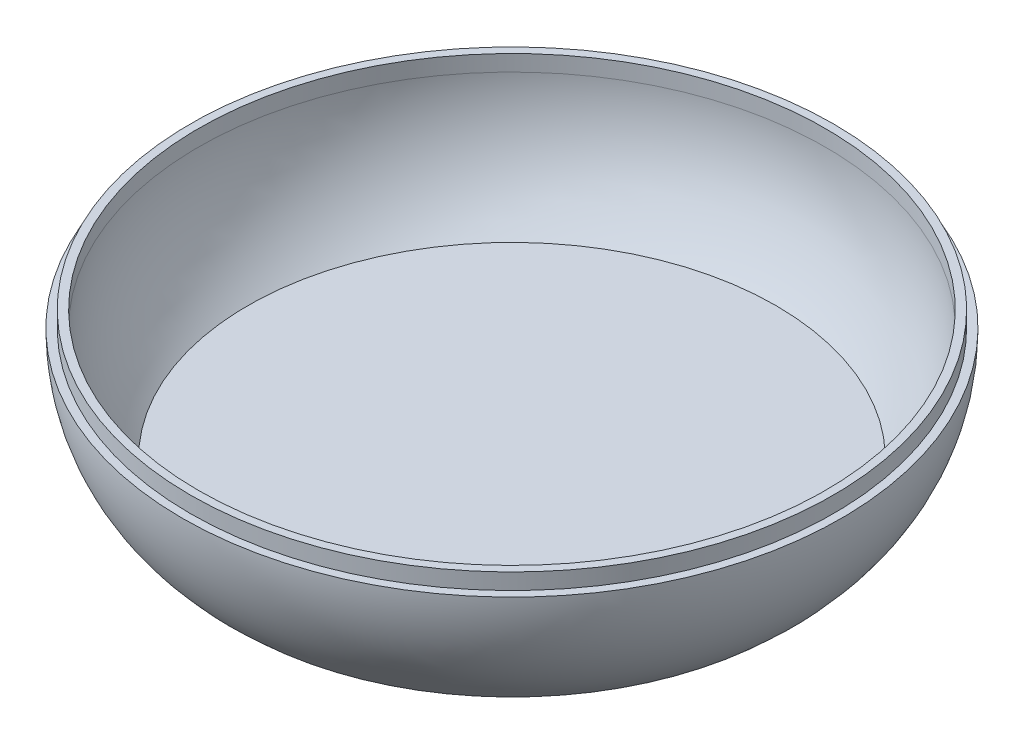
ISO-10303-21;
HEADER;
FILE_DESCRIPTION(('STEP AP214'),'2;1');
FILE_NAME('part.step','',(''),(''),'','','');
FILE_SCHEMA(('AUTOMOTIVE_DESIGN { 1 0 10303 214 1 1 1 1 }'));
ENDSEC;
DATA;
#1=APPLICATION_CONTEXT('core data for automotive mechanical design processes');
#2=APPLICATION_PROTOCOL_DEFINITION('international standard','automotive_design',2000,#1);
#3=PRODUCT_CONTEXT('',#1,'mechanical');
#4=PRODUCT('Part','Part','',(#3));
#5=PRODUCT_RELATED_PRODUCT_CATEGORY('part','',(#4));
#6=PRODUCT_DEFINITION_FORMATION('','',#4);
#7=PRODUCT_DEFINITION_CONTEXT('part definition',#1,'design');
#8=PRODUCT_DEFINITION('design','',#6,#7);
#9=PRODUCT_DEFINITION_SHAPE('','',#8);
#10=(LENGTH_UNIT() NAMED_UNIT(*) SI_UNIT(.MILLI.,.METRE.));
#11=(NAMED_UNIT(*) PLANE_ANGLE_UNIT() SI_UNIT($,.RADIAN.));
#12=(NAMED_UNIT(*) SI_UNIT($,.STERADIAN.) SOLID_ANGLE_UNIT());
#13=UNCERTAINTY_MEASURE_WITH_UNIT(LENGTH_MEASURE(1.E-05),#10,'distance_accuracy_value','');
#14=(GEOMETRIC_REPRESENTATION_CONTEXT(3) GLOBAL_UNCERTAINTY_ASSIGNED_CONTEXT((#13)) GLOBAL_UNIT_ASSIGNED_CONTEXT((#10,
#11,#12)) REPRESENTATION_CONTEXT('',''));
#15=CARTESIAN_POINT('',(0.,0.,0.));
#16=DIRECTION('',(0.,0.,1.));
#17=DIRECTION('',(1.,0.,0.));
#18=AXIS2_PLACEMENT_3D('',#15,#16,#17);
#19=CARTESIAN_POINT('',(0.,0.,0.));
#20=DIRECTION('',(0.,-1.,0.));
#21=DIRECTION('',(0.,0.,-1.));
#22=AXIS2_PLACEMENT_3D('',#19,#20,#21);
#23=PLANE('',#22);
#24=CARTESIAN_POINT('',(41.,0.,0.));
#25=DIRECTION('',(0.,1.,0.));
#26=DIRECTION('',(0.,0.,1.));
#27=AXIS2_PLACEMENT_3D('',#24,#25,#26);
#28=CIRCLE('',#27,40.);
#29=CARTESIAN_POINT('',(41.,0.,40.));
#30=VERTEX_POINT('',#29);
#31=EDGE_CURVE('E10',#30,#30,#28,.T.);
#32=ORIENTED_EDGE('',*,*,#31,.F.);
#33=EDGE_LOOP('',(#32));
#34=FACE_BOUND('',#33,.T.);
#35=CARTESIAN_POINT('',(41.,0.,0.));
#36=DIRECTION('',(0.,1.,0.));
#37=DIRECTION('',(0.,0.,1.));
#38=AXIS2_PLACEMENT_3D('',#35,#36,#37);
#39=CIRCLE('',#38,41.);
#40=CARTESIAN_POINT('',(41.,0.,41.));
#41=VERTEX_POINT('',#40);
#42=EDGE_CURVE('E42',#41,#41,#39,.T.);
#43=ORIENTED_EDGE('',*,*,#42,.T.);
#44=EDGE_LOOP('',(#43));
#45=FACE_BOUND('',#44,.T.);
#46=ADVANCED_FACE('F39',(#34,#45),#23,.F.);
#47=CARTESIAN_POINT('',(41.,0.,0.));
#48=DIRECTION('',(0.,1.,0.));
#49=DIRECTION('',(0.,0.,1.));
#50=AXIS2_PLACEMENT_3D('',#47,#48,#49);
#51=DEGENERATE_TOROIDAL_SURFACE('',#50,20.,21.,.T.);
#52=CARTESIAN_POINT('',(41.,-16.,0.));
#53=DIRECTION('',(0.,1.,0.));
#54=DIRECTION('',(0.,0.,1.));
#55=AXIS2_PLACEMENT_3D('',#52,#53,#54);
#56=CIRCLE('',#55,33.6014705087355);
#57=CARTESIAN_POINT('',(41.,-16.,33.6014705087355));
#58=VERTEX_POINT('',#57);
#59=EDGE_CURVE('E52',#58,#58,#56,.T.);
#60=ORIENTED_EDGE('',*,*,#59,.T.);
#61=EDGE_LOOP('',(#60));
#62=FACE_BOUND('',#61,.T.);
#63=ORIENTED_EDGE('',*,*,#42,.F.);
#64=EDGE_LOOP('',(#63));
#65=FACE_BOUND('',#64,.T.);
#66=ADVANCED_FACE('F64',(#62,#65),#51,.T.);
#67=CARTESIAN_POINT('',(0.,-16.,0.));
#68=DIRECTION('',(0.,-1.,0.));
#69=DIRECTION('',(0.,0.,-1.));
#70=AXIS2_PLACEMENT_3D('',#67,#68,#69);
#71=PLANE('',#70);
#72=ORIENTED_EDGE('',*,*,#59,.F.);
#73=EDGE_LOOP('',(#72));
#74=FACE_BOUND('',#73,.T.);
#75=ADVANCED_FACE('F67',(#74),#71,.T.);
#76=CARTESIAN_POINT('',(41.,2.,0.));
#77=DIRECTION('',(0.,1.,0.));
#78=DIRECTION('',(0.,0.,1.));
#79=AXIS2_PLACEMENT_3D('',#76,#77,#78);
#80=PLANE('',#79);
#81=CARTESIAN_POINT('',(41.,2.,0.));
#82=DIRECTION('',(0.,1.,0.));
#83=DIRECTION('',(0.,0.,1.));
#84=AXIS2_PLACEMENT_3D('',#81,#82,#83);
#85=CIRCLE('',#84,40.);
#86=CARTESIAN_POINT('',(41.,2.,40.));
#87=VERTEX_POINT('',#86);
#88=EDGE_CURVE('E55',#87,#87,#85,.T.);
#89=ORIENTED_EDGE('',*,*,#88,.T.);
#90=EDGE_LOOP('',(#89));
#91=FACE_BOUND('',#90,.T.);
#92=CARTESIAN_POINT('',(41.,2.,0.));
#93=DIRECTION('',(0.,1.,0.));
#94=DIRECTION('',(0.,0.,1.));
#95=AXIS2_PLACEMENT_3D('',#92,#93,#94);
#96=CIRCLE('',#95,39.);
#97=CARTESIAN_POINT('',(41.,2.,39.));
#98=VERTEX_POINT('',#97);
#99=EDGE_CURVE('E144',#98,#98,#96,.T.);
#100=ORIENTED_EDGE('',*,*,#99,.F.);
#101=EDGE_LOOP('',(#100));
#102=FACE_BOUND('',#101,.T.);
#103=ADVANCED_FACE('F69',(#91,#102),#80,.T.);
#104=CARTESIAN_POINT('',(41.,2.,0.));
#105=DIRECTION('',(0.,-1.,0.));
#106=DIRECTION('',(0.,0.,-1.));
#107=AXIS2_PLACEMENT_3D('',#104,#105,#106);
#108=CYLINDRICAL_SURFACE('',#107,40.);
#109=ORIENTED_EDGE('',*,*,#88,.F.);
#110=EDGE_LOOP('',(#109));
#111=FACE_BOUND('',#110,.T.);
#112=ORIENTED_EDGE('',*,*,#31,.T.);
#113=EDGE_LOOP('',(#112));
#114=FACE_BOUND('',#113,.T.);
#115=ADVANCED_FACE('F75',(#111,#114),#108,.T.);
#116=CARTESIAN_POINT('',(41.,2.,0.));
#117=DIRECTION('',(0.,-1.,0.));
#118=DIRECTION('',(0.,0.,-1.));
#119=AXIS2_PLACEMENT_3D('',#116,#117,#118);
#120=CYLINDRICAL_SURFACE('',#119,39.);
#121=ORIENTED_EDGE('',*,*,#99,.T.);
#122=EDGE_LOOP('',(#121));
#123=FACE_BOUND('',#122,.T.);
#124=CARTESIAN_POINT('',(41.,0.,0.));
#125=DIRECTION('',(0.,1.,0.));
#126=DIRECTION('',(0.,0.,1.));
#127=AXIS2_PLACEMENT_3D('',#124,#125,#126);
#128=CIRCLE('',#127,39.);
#129=CARTESIAN_POINT('',(41.,0.,39.));
#130=VERTEX_POINT('',#129);
#131=EDGE_CURVE('E147',#130,#130,#128,.T.);
#132=ORIENTED_EDGE('',*,*,#131,.F.);
#133=EDGE_LOOP('',(#132));
#134=FACE_BOUND('',#133,.T.);
#135=ADVANCED_FACE('F113',(#123,#134),#120,.F.);
#136=CARTESIAN_POINT('',(0.,-14.,0.));
#137=DIRECTION('',(0.,-1.,0.));
#138=DIRECTION('',(0.,0.,-1.));
#139=AXIS2_PLACEMENT_3D('',#136,#137,#138);
#140=PLANE('',#139);
#141=CARTESIAN_POINT('',(41.,-14.,0.));
#142=DIRECTION('',(0.,-1.,0.));
#143=DIRECTION('',(0.,0.,-1.));
#144=AXIS2_PLACEMENT_3D('',#141,#142,#143);
#145=CIRCLE('',#144,32.8452325786651);
#146=CARTESIAN_POINT('',(41.,-14.,-32.8452325786651));
#147=VERTEX_POINT('',#146);
#148=EDGE_CURVE('E57',#147,#147,#145,.F.);
#149=ORIENTED_EDGE('',*,*,#148,.T.);
#150=EDGE_LOOP('',(#149));
#151=FACE_BOUND('',#150,.T.);
#152=ADVANCED_FACE('F104',(#151),#140,.F.);
#153=CARTESIAN_POINT('',(41.,0.,0.));
#154=DIRECTION('',(0.,1.,0.));
#155=DIRECTION('',(0.,0.,1.));
#156=AXIS2_PLACEMENT_3D('',#153,#154,#155);
#157=TOROIDAL_SURFACE('',#156,20.,19.);
#158=ORIENTED_EDGE('',*,*,#148,.F.);
#159=EDGE_LOOP('',(#158));
#160=FACE_BOUND('',#159,.T.);
#161=ORIENTED_EDGE('',*,*,#131,.T.);
#162=EDGE_LOOP('',(#161));
#163=FACE_BOUND('',#162,.T.);
#164=ADVANCED_FACE('F101',(#160,#163),#157,.F.);
#165=CLOSED_SHELL('',(#46,#66,#75,#103,#115,#135,#152,#164));
#166=MANIFOLD_SOLID_BREP('B2',#165);
#167=ADVANCED_BREP_SHAPE_REPRESENTATION('',(#18,#166),#14);
#168=SHAPE_DEFINITION_REPRESENTATION(#9,#167);
ENDSEC;
END-ISO-10303-21;
